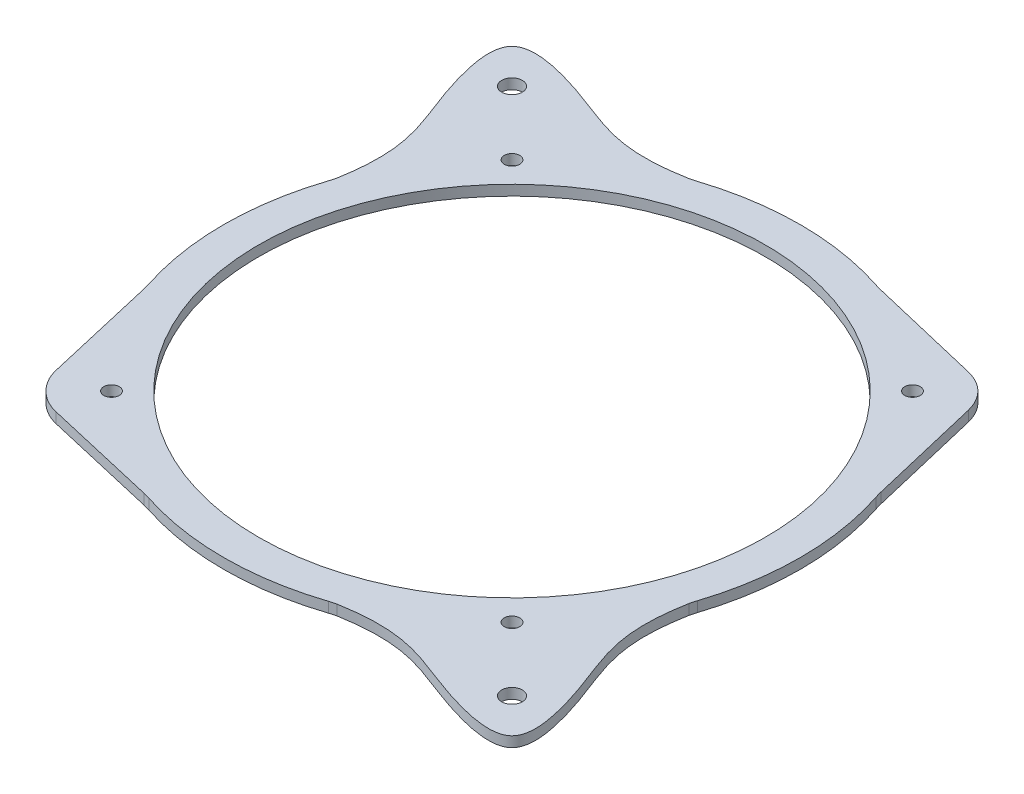
ISO-10303-21;
HEADER;
FILE_DESCRIPTION(('STEP AP214'),'2;1');
FILE_NAME('part.step','',(''),(''),'','','');
FILE_SCHEMA(('AUTOMOTIVE_DESIGN { 1 0 10303 214 1 1 1 1 }'));
ENDSEC;
DATA;
#1=APPLICATION_CONTEXT('core data for automotive mechanical design processes');
#2=APPLICATION_PROTOCOL_DEFINITION('international standard','automotive_design',2000,#1);
#3=PRODUCT_CONTEXT('',#1,'mechanical');
#4=PRODUCT('Part','Part','',(#3));
#5=PRODUCT_RELATED_PRODUCT_CATEGORY('part','',(#4));
#6=PRODUCT_DEFINITION_FORMATION('','',#4);
#7=PRODUCT_DEFINITION_CONTEXT('part definition',#1,'design');
#8=PRODUCT_DEFINITION('design','',#6,#7);
#9=PRODUCT_DEFINITION_SHAPE('','',#8);
#10=(LENGTH_UNIT() NAMED_UNIT(*) SI_UNIT(.MILLI.,.METRE.));
#11=(NAMED_UNIT(*) PLANE_ANGLE_UNIT() SI_UNIT($,.RADIAN.));
#12=(NAMED_UNIT(*) SI_UNIT($,.STERADIAN.) SOLID_ANGLE_UNIT());
#13=UNCERTAINTY_MEASURE_WITH_UNIT(LENGTH_MEASURE(1.E-05),#10,'distance_accuracy_value','');
#14=(GEOMETRIC_REPRESENTATION_CONTEXT(3) GLOBAL_UNCERTAINTY_ASSIGNED_CONTEXT((#13)) GLOBAL_UNIT_ASSIGNED_CONTEXT((#10,
#11,#12)) REPRESENTATION_CONTEXT('',''));
#15=CARTESIAN_POINT('',(0.,0.,0.));
#16=DIRECTION('',(0.,0.,1.));
#17=DIRECTION('',(1.,0.,0.));
#18=AXIS2_PLACEMENT_3D('',#15,#16,#17);
#19=CARTESIAN_POINT('',(-57.9062102339077,2.,-58.0554899764126));
#20=DIRECTION('',(0.,1.,0.));
#21=DIRECTION('',(0.,0.,1.));
#22=AXIS2_PLACEMENT_3D('',#19,#20,#21);
#23=PLANE('',#22);
#24=CARTESIAN_POINT('',(-51.265241636024,2.,-51.2652416360242));
#25=DIRECTION('',(0.,1.,0.));
#26=DIRECTION('',(0.,0.,1.));
#27=AXIS2_PLACEMENT_3D('',#24,#25,#26);
#28=CIRCLE('',#27,2.);
#29=CARTESIAN_POINT('',(-51.265241636024,2.,-49.2652416360242));
#30=VERTEX_POINT('',#29);
#31=EDGE_CURVE('E649',#30,#30,#28,.T.);
#32=ORIENTED_EDGE('',*,*,#31,.F.);
#33=EDGE_LOOP('',(#32));
#34=FACE_BOUND('',#33,.T.);
#35=CARTESIAN_POINT('',(51.2652416360254,2.,51.2652416360251));
#36=DIRECTION('',(0.,1.,0.));
#37=DIRECTION('',(0.,0.,-1.));
#38=AXIS2_PLACEMENT_3D('',#35,#36,#37);
#39=CIRCLE('',#38,2.00000000000001);
#40=CARTESIAN_POINT('',(51.2652416360254,2.,49.2652416360251));
#41=VERTEX_POINT('',#40);
#42=EDGE_CURVE('E641',#41,#41,#39,.T.);
#43=ORIENTED_EDGE('',*,*,#42,.F.);
#44=EDGE_LOOP('',(#43));
#45=FACE_BOUND('',#44,.T.);
#46=CARTESIAN_POINT('',(38.8907000000007,2.,38.8907000000005));
#47=DIRECTION('',(0.,1.,0.));
#48=DIRECTION('',(0.,0.,1.));
#49=AXIS2_PLACEMENT_3D('',#46,#47,#48);
#50=CIRCLE('',#49,1.5);
#51=CARTESIAN_POINT('',(38.8907000000007,2.,40.3907000000005));
#52=VERTEX_POINT('',#51);
#53=EDGE_CURVE('E621',#52,#52,#50,.T.);
#54=ORIENTED_EDGE('',*,*,#53,.F.);
#55=EDGE_LOOP('',(#54));
#56=FACE_BOUND('',#55,.T.);
#57=CARTESIAN_POINT('',(-38.8906999999993,2.,-38.8906999999996));
#58=DIRECTION('',(0.,1.,0.));
#59=DIRECTION('',(0.,0.,1.));
#60=AXIS2_PLACEMENT_3D('',#57,#58,#59);
#61=CIRCLE('',#60,1.5);
#62=CARTESIAN_POINT('',(-38.8906999999993,2.,-37.3906999999996));
#63=VERTEX_POINT('',#62);
#64=EDGE_CURVE('E605',#63,#63,#61,.T.);
#65=ORIENTED_EDGE('',*,*,#64,.F.);
#66=EDGE_LOOP('',(#65));
#67=FACE_BOUND('',#66,.T.);
#68=CARTESIAN_POINT('',(-18.5361486391086,2.,-52.9221194930724));
#69=CARTESIAN_POINT('',(-33.0898322809832,2.,-50.2752101267289));
#70=CARTESIAN_POINT('',(-38.2523816644955,2.,-56.5087525567802));
#71=CARTESIAN_POINT('',(-60.5913437385731,2.,-60.5915146691653));
#72=CARTESIAN_POINT('',(-56.5307882243021,2.,-38.3725544400051));
#73=CARTESIAN_POINT('',(-50.3627584827895,2.,-33.1719340145109));
#74=CARTESIAN_POINT('',(-52.8217319837832,2.,-18.8203126500064));
#75=B_SPLINE_CURVE_WITH_KNOTS('',3,(#68,#69,#70,#71,#72,#73,#74),.UNSPECIFIED.,.F.,.F.,(4,1,1,1,
4),(0.,0.378239645572201,0.501703935338034,0.625168225103867,1.),.UNSPECIFIED.);
#76=CARTESIAN_POINT('',(-18.5361486391086,2.,-52.9221194930724));
#77=VERTEX_POINT('',#76);
#78=CARTESIAN_POINT('',(-52.8217319837832,2.,-18.8203126500064));
#79=VERTEX_POINT('',#78);
#80=EDGE_CURVE('E311',#77,#79,#75,.T.);
#81=ORIENTED_EDGE('',*,*,#80,.T.);
#82=CARTESIAN_POINT('',(-68.3897200150771,2.,-22.5132449073711));
#83=DIRECTION('',(0.,-1.,0.));
#84=DIRECTION('',(0.,0.,1.));
#85=AXIS2_PLACEMENT_3D('',#82,#83,#84);
#86=CIRCLE('',#85,15.9999999999999);
#87=CARTESIAN_POINT('',(-53.1920044561713,2.,-17.5103015946212));
#88=VERTEX_POINT('',#87);
#89=EDGE_CURVE('E144',#79,#88,#86,.T.);
#90=ORIENTED_EDGE('',*,*,#89,.T.);
#91=CARTESIAN_POINT('',(3.88578058618805E-13,2.,3.85108611666851E-13));
#92=DIRECTION('',(0.,1.,0.));
#93=DIRECTION('',(0.,0.,1.));
#94=AXIS2_PLACEMENT_3D('',#91,#92,#93);
#95=CIRCLE('',#94,55.9999999999999);
#96=CARTESIAN_POINT('',(-53.2853459187858,2.,17.2241664621337));
#97=VERTEX_POINT('',#96);
#98=EDGE_CURVE('E391',#88,#97,#95,.T.);
#99=ORIENTED_EDGE('',*,*,#98,.T.);
#100=CARTESIAN_POINT('',(-68.5097304670106,2.,22.145356879886));
#101=DIRECTION('',(0.,-1.,0.));
#102=DIRECTION('',(0.,0.,1.));
#103=AXIS2_PLACEMENT_3D('',#100,#101,#102);
#104=CIRCLE('',#103,16.0000000000001);
#105=CARTESIAN_POINT('',(-52.9221194930763,2.,18.5361486391101));
#106=VERTEX_POINT('',#105);
#107=EDGE_CURVE('E411',#97,#106,#104,.T.);
#108=ORIENTED_EDGE('',*,*,#107,.T.);
#109=DIRECTION('',(0.225575515048493,0.,0.974225685870891));
#110=VECTOR('',#109,1.);
#111=CARTESIAN_POINT('',(-47.7632742489976,2.,40.8164016405666));
#112=LINE('',#111,#110);
#113=CARTESIAN_POINT('',(-47.7632742489976,2.,40.8164016405666));
#114=VERTEX_POINT('',#113);
#115=EDGE_CURVE('E407',#106,#114,#112,.T.);
#116=ORIENTED_EDGE('',*,*,#115,.T.);
#117=CARTESIAN_POINT('',(-38.9952430761602,2.,38.7862220051302));
#118=DIRECTION('',(0.,1.,0.));
#119=DIRECTION('',(0.,0.,1.));
#120=AXIS2_PLACEMENT_3D('',#117,#118,#119);
#121=CIRCLE('',#120,8.99999999999942);
#122=CARTESIAN_POINT('',(-45.253835364579,2.,45.2538353645801));
#123=VERTEX_POINT('',#122);
#124=EDGE_CURVE('E410',#114,#123,#121,.T.);
#125=ORIENTED_EDGE('',*,*,#124,.T.);
#126=CARTESIAN_POINT('',(-38.7862220051291,2.,38.9952430761613));
#127=DIRECTION('',(0.,1.,0.));
#128=DIRECTION('',(0.,0.,-1.));
#129=AXIS2_PLACEMENT_3D('',#126,#127,#128);
#130=CIRCLE('',#129,8.99999999999942);
#131=CARTESIAN_POINT('',(-40.8164016405654,2.,47.7632742489988));
#132=VERTEX_POINT('',#131);
#133=EDGE_CURVE('E415',#123,#132,#130,.T.);
#134=ORIENTED_EDGE('',*,*,#133,.T.);
#135=DIRECTION('',(0.974225685870891,0.,0.225575515048493));
#136=VECTOR('',#135,1.);
#137=CARTESIAN_POINT('',(-40.8164016405654,2.,47.7632742489988));
#138=LINE('',#137,#136);
#139=CARTESIAN_POINT('',(-18.536148639109,2.,52.9221194930774));
#140=VERTEX_POINT('',#139);
#141=EDGE_CURVE('E422',#132,#140,#138,.T.);
#142=ORIENTED_EDGE('',*,*,#141,.T.);
#143=CARTESIAN_POINT('',(-22.1453568798849,2.,68.5097304670117));
#144=DIRECTION('',(0.,-1.,0.));
#145=DIRECTION('',(0.,0.,-1.));
#146=AXIS2_PLACEMENT_3D('',#143,#144,#145);
#147=CIRCLE('',#146,16.0000000000001);
#148=CARTESIAN_POINT('',(-17.2241664621326,2.,53.2853459187871));
#149=VERTEX_POINT('',#148);
#150=EDGE_CURVE('E425',#140,#149,#147,.T.);
#151=ORIENTED_EDGE('',*,*,#150,.T.);
#152=CARTESIAN_POINT('',(3.88578058618805E-13,2.,3.85108611666851E-13));
#153=DIRECTION('',(0.,1.,0.));
#154=DIRECTION('',(0.,0.,-1.));
#155=AXIS2_PLACEMENT_3D('',#152,#153,#154);
#156=CIRCLE('',#155,56.0000000000003);
#157=CARTESIAN_POINT('',(17.5103015946224,2.,53.1920044561725));
#158=VERTEX_POINT('',#157);
#159=EDGE_CURVE('E428',#149,#158,#156,.T.);
#160=ORIENTED_EDGE('',*,*,#159,.T.);
#161=CARTESIAN_POINT('',(22.5132449073722,2.,68.3897200150783));
#162=DIRECTION('',(0.,-1.,0.));
#163=DIRECTION('',(0.,0.,-1.));
#164=AXIS2_PLACEMENT_3D('',#161,#162,#163);
#165=CIRCLE('',#164,15.9999999999999);
#166=CARTESIAN_POINT('',(18.8203126500077,2.,52.8217319837837));
#167=VERTEX_POINT('',#166);
#168=EDGE_CURVE('E431',#158,#167,#165,.T.);
#169=ORIENTED_EDGE('',*,*,#168,.T.);
#170=CARTESIAN_POINT('',(18.8203126500077,2.,52.8217319837837));
#171=CARTESIAN_POINT('',(33.1719340145121,2.,50.36275848279));
#172=CARTESIAN_POINT('',(38.3725544400063,2.,56.5307882243025));
#173=CARTESIAN_POINT('',(60.5915146691666,2.,60.5913437385733));
#174=CARTESIAN_POINT('',(56.5087525567814,2.,38.2523816644958));
#175=CARTESIAN_POINT('',(50.2752101267299,2.,33.0898322809835));
#176=CARTESIAN_POINT('',(52.9221194930734,2.,18.5361486391089));
#177=B_SPLINE_CURVE_WITH_KNOTS('',3,(#170,#171,#172,#173,#174,#175,#176),.UNSPECIFIED.,.F.,.F.,
(4,1,1,1,4),(0.,0.374831774896133,0.498296064661966,0.621760354427798,1.),.UNSPECIFIED.);
#178=CARTESIAN_POINT('',(52.9221194930736,2.,18.5361486391097));
#179=VERTEX_POINT('',#178);
#180=EDGE_CURVE('E434',#167,#179,#177,.T.);
#181=ORIENTED_EDGE('',*,*,#180,.T.);
#182=CARTESIAN_POINT('',(68.5097304670078,2.,22.1453568798855));
#183=DIRECTION('',(0.,-1.,0.));
#184=DIRECTION('',(0.,0.,-1.));
#185=AXIS2_PLACEMENT_3D('',#182,#183,#184);
#186=CIRCLE('',#185,15.9999999999999);
#187=CARTESIAN_POINT('',(53.2853459187831,2.,17.2241664621332));
#188=VERTEX_POINT('',#187);
#189=EDGE_CURVE('E440',#179,#188,#186,.T.);
#190=ORIENTED_EDGE('',*,*,#189,.T.);
#191=CARTESIAN_POINT('',(3.88578058618805E-13,2.,3.85108611666851E-13));
#192=DIRECTION('',(0.,1.,0.));
#193=DIRECTION('',(0.,0.,-1.));
#194=AXIS2_PLACEMENT_3D('',#191,#192,#193);
#195=CIRCLE('',#194,55.9999999999964);
#196=CARTESIAN_POINT('',(53.1920044561682,2.,-17.5103015946187));
#197=VERTEX_POINT('',#196);
#198=EDGE_CURVE('E563',#188,#197,#195,.T.);
#199=ORIENTED_EDGE('',*,*,#198,.T.);
#200=CARTESIAN_POINT('',(68.3897200150744,2.,-22.5132449073677));
#201=DIRECTION('',(0.,-1.,0.));
#202=DIRECTION('',(0.,0.,-1.));
#203=AXIS2_PLACEMENT_3D('',#200,#201,#202);
#204=CIRCLE('',#203,15.9999999999999);
#205=CARTESIAN_POINT('',(52.8217319837804,2.,-18.820312650003));
#206=VERTEX_POINT('',#205);
#207=EDGE_CURVE('E542',#197,#206,#204,.T.);
#208=ORIENTED_EDGE('',*,*,#207,.T.);
#209=DIRECTION('',(-0.230808266085289,0.,-0.97299925195588));
#210=VECTOR('',#209,1.);
#211=CARTESIAN_POINT('',(52.8217319837804,2.,-18.820312650003));
#212=LINE('',#211,#210);
#213=CARTESIAN_POINT('',(47.5432152727266,2.,-41.0725174709259));
#214=VERTEX_POINT('',#213);
#215=EDGE_CURVE('E554',#206,#214,#212,.T.);
#216=ORIENTED_EDGE('',*,*,#215,.T.);
#217=CARTESIAN_POINT('',(38.7862220051243,2.,-38.9952430761583));
#218=DIRECTION('',(0.,1.,0.));
#219=DIRECTION('',(0.,0.,-1.));
#220=AXIS2_PLACEMENT_3D('',#217,#218,#219);
#221=CIRCLE('',#220,8.99999999999942);
#222=CARTESIAN_POINT('',(45.2538353645762,2.,-45.2538353645751));
#223=VERTEX_POINT('',#222);
#224=EDGE_CURVE('E550',#214,#223,#221,.T.);
#225=ORIENTED_EDGE('',*,*,#224,.T.);
#226=CARTESIAN_POINT('',(38.9952430761595,2.,-38.7862220051232));
#227=DIRECTION('',(0.,1.,0.));
#228=DIRECTION('',(0.,0.,1.));
#229=AXIS2_PLACEMENT_3D('',#226,#227,#228);
#230=CIRCLE('',#229,8.9999999999994);
#231=CARTESIAN_POINT('',(41.072517470927,2.,-47.5432152727255));
#232=VERTEX_POINT('',#231);
#233=EDGE_CURVE('E553',#223,#232,#230,.T.);
#234=ORIENTED_EDGE('',*,*,#233,.T.);
#235=DIRECTION('',(-0.97299925195588,0.,-0.230808266085289));
#236=VECTOR('',#235,1.);
#237=CARTESIAN_POINT('',(18.8203126500042,2.,-52.8217319837792));
#238=LINE('',#237,#236);
#239=CARTESIAN_POINT('',(18.8203126500042,2.,-52.8217319837792));
#240=VERTEX_POINT('',#239);
#241=EDGE_CURVE('E205',#232,#240,#238,.T.);
#242=ORIENTED_EDGE('',*,*,#241,.T.);
#243=CARTESIAN_POINT('',(22.5132449073689,2.,-68.3897200150733));
#244=DIRECTION('',(0.,-1.,0.));
#245=DIRECTION('',(0.,0.,1.));
#246=AXIS2_PLACEMENT_3D('',#243,#244,#245);
#247=CIRCLE('',#246,16.);
#248=CARTESIAN_POINT('',(17.5103015946199,2.,-53.1920044561671));
#249=VERTEX_POINT('',#248);
#250=EDGE_CURVE('E199',#240,#249,#247,.T.);
#251=ORIENTED_EDGE('',*,*,#250,.T.);
#252=CARTESIAN_POINT('',(-2.29687533889309E-12,2.,4.40669160380655E-12));
#253=DIRECTION('',(0.,1.,0.));
#254=DIRECTION('',(0.,0.,1.));
#255=AXIS2_PLACEMENT_3D('',#252,#253,#254);
#256=CIRCLE('',#255,56.);
#257=CARTESIAN_POINT('',(-17.2241664621319,2.,-53.2853459187821));
#258=VERTEX_POINT('',#257);
#259=EDGE_CURVE('E203',#249,#258,#256,.T.);
#260=ORIENTED_EDGE('',*,*,#259,.T.);
#261=CARTESIAN_POINT('',(-17.2241664621319,2.,-53.2853459187821));
#262=CARTESIAN_POINT('',(-18.5361486391086,2.,-52.9221194930724));
#263=B_SPLINE_CURVE_WITH_KNOTS('',1,(#261,#262),.UNSPECIFIED.,.F.,.F.,(2,2),(0.,1.),.UNSPECIFIED.);
#264=EDGE_CURVE('E60',#258,#77,#263,.T.);
#265=ORIENTED_EDGE('',*,*,#264,.T.);
#266=EDGE_LOOP('',(#81,#90,#99,#108,#116,#125,#134,#142,#151,#160,#169,#181,#190,#199,#208,#216,
#225,#234,#242,#251,#260,#265));
#267=FACE_BOUND('',#266,.T.);
#268=CARTESIAN_POINT('',(3.88578058618805E-13,2.,3.85108611666851E-13));
#269=DIRECTION('',(0.,1.,0.));
#270=DIRECTION('',(0.,0.,1.));
#271=AXIS2_PLACEMENT_3D('',#268,#269,#270);
#272=CIRCLE('',#271,49.2);
#273=CARTESIAN_POINT('',(3.88578058618805E-13,2.,49.2000000000004));
#274=VERTEX_POINT('',#273);
#275=EDGE_CURVE('E240',#274,#274,#272,.T.);
#276=ORIENTED_EDGE('',*,*,#275,.F.);
#277=EDGE_LOOP('',(#276));
#278=FACE_BOUND('',#277,.T.);
#279=CARTESIAN_POINT('',(38.8907000000007,2.,-38.8906999999996));
#280=DIRECTION('',(0.,1.,0.));
#281=DIRECTION('',(0.,0.,-1.));
#282=AXIS2_PLACEMENT_3D('',#279,#280,#281);
#283=CIRCLE('',#282,1.5);
#284=CARTESIAN_POINT('',(38.8907000000007,2.,-40.3906999999996));
#285=VERTEX_POINT('',#284);
#286=EDGE_CURVE('E613',#285,#285,#283,.T.);
#287=ORIENTED_EDGE('',*,*,#286,.F.);
#288=EDGE_LOOP('',(#287));
#289=FACE_BOUND('',#288,.T.);
#290=CARTESIAN_POINT('',(-38.8906999999993,2.,38.8907000000005));
#291=DIRECTION('',(0.,1.,0.));
#292=DIRECTION('',(0.,0.,-1.));
#293=AXIS2_PLACEMENT_3D('',#290,#291,#292);
#294=CIRCLE('',#293,1.5);
#295=CARTESIAN_POINT('',(-38.8906999999993,2.,37.3907000000005));
#296=VERTEX_POINT('',#295);
#297=EDGE_CURVE('E629',#296,#296,#294,.T.);
#298=ORIENTED_EDGE('',*,*,#297,.F.);
#299=EDGE_LOOP('',(#298));
#300=FACE_BOUND('',#299,.T.);
#301=ADVANCED_FACE('F41',(#34,#45,#56,#67,#267,#278,#289,#300),#23,.T.);
#302=CARTESIAN_POINT('',(-57.9062102339077,0.,-58.0554899764126));
#303=DIRECTION('',(0.,1.,0.));
#304=DIRECTION('',(0.,0.,1.));
#305=AXIS2_PLACEMENT_3D('',#302,#303,#304);
#306=PLANE('',#305);
#307=CARTESIAN_POINT('',(-51.265241636024,0.,-51.2652416360242));
#308=DIRECTION('',(0.,1.,0.));
#309=DIRECTION('',(0.,0.,1.));
#310=AXIS2_PLACEMENT_3D('',#307,#308,#309);
#311=CIRCLE('',#310,2.);
#312=CARTESIAN_POINT('',(-51.265241636024,0.,-49.2652416360242));
#313=VERTEX_POINT('',#312);
#314=EDGE_CURVE('E637',#313,#313,#311,.T.);
#315=ORIENTED_EDGE('',*,*,#314,.T.);
#316=EDGE_LOOP('',(#315));
#317=FACE_BOUND('',#316,.T.);
#318=CARTESIAN_POINT('',(51.2652416360254,0.,51.2652416360251));
#319=DIRECTION('',(0.,1.,0.));
#320=DIRECTION('',(0.,0.,-1.));
#321=AXIS2_PLACEMENT_3D('',#318,#319,#320);
#322=CIRCLE('',#321,2.00000000000001);
#323=CARTESIAN_POINT('',(51.2652416360254,0.,49.2652416360251));
#324=VERTEX_POINT('',#323);
#325=EDGE_CURVE('E645',#324,#324,#322,.T.);
#326=ORIENTED_EDGE('',*,*,#325,.T.);
#327=EDGE_LOOP('',(#326));
#328=FACE_BOUND('',#327,.T.);
#329=CARTESIAN_POINT('',(-18.5361486391086,0.,-52.9221194930724));
#330=CARTESIAN_POINT('',(-33.0898322809832,0.,-50.2752101267289));
#331=CARTESIAN_POINT('',(-38.2523816644955,0.,-56.5087525567802));
#332=CARTESIAN_POINT('',(-60.5913437385731,0.,-60.5915146691653));
#333=CARTESIAN_POINT('',(-56.5307882243021,0.,-38.3725544400051));
#334=CARTESIAN_POINT('',(-50.3627584827895,0.,-33.1719340145109));
#335=CARTESIAN_POINT('',(-52.8217319837832,0.,-18.8203126500064));
#336=B_SPLINE_CURVE_WITH_KNOTS('',3,(#329,#330,#331,#332,#333,#334,#335),.UNSPECIFIED.,.F.,.F.,
(4,1,1,1,4),(0.,0.378239645572201,0.501703935338034,0.625168225103867,1.),.UNSPECIFIED.);
#337=CARTESIAN_POINT('',(-18.5361486391086,0.,-52.9221194930724));
#338=VERTEX_POINT('',#337);
#339=CARTESIAN_POINT('',(-52.8217319837832,0.,-18.8203126500064));
#340=VERTEX_POINT('',#339);
#341=EDGE_CURVE('E230',#338,#340,#336,.T.);
#342=ORIENTED_EDGE('',*,*,#341,.F.);
#343=CARTESIAN_POINT('',(-17.2241664621319,0.,-53.2853459187821));
#344=CARTESIAN_POINT('',(-18.5361486391086,0.,-52.9221194930724));
#345=B_SPLINE_CURVE_WITH_KNOTS('',1,(#343,#344),.UNSPECIFIED.,.F.,.F.,(2,2),(0.,1.),.UNSPECIFIED.);
#346=CARTESIAN_POINT('',(-17.2241664621319,0.,-53.2853459187821));
#347=VERTEX_POINT('',#346);
#348=EDGE_CURVE('E136',#347,#338,#345,.T.);
#349=ORIENTED_EDGE('',*,*,#348,.F.);
#350=CARTESIAN_POINT('',(3.88578058618805E-13,0.,3.85108611666851E-13));
#351=DIRECTION('',(0.,1.,0.));
#352=DIRECTION('',(0.,0.,1.));
#353=AXIS2_PLACEMENT_3D('',#350,#351,#352);
#354=CIRCLE('',#353,55.999999999996);
#355=CARTESIAN_POINT('',(17.5103015946199,0.,-53.1920044561671));
#356=VERTEX_POINT('',#355);
#357=EDGE_CURVE('E130',#356,#347,#354,.T.);
#358=ORIENTED_EDGE('',*,*,#357,.F.);
#359=CARTESIAN_POINT('',(22.5132449073689,0.,-68.3897200150733));
#360=DIRECTION('',(0.,-1.,0.));
#361=DIRECTION('',(0.,0.,1.));
#362=AXIS2_PLACEMENT_3D('',#359,#360,#361);
#363=CIRCLE('',#362,16.);
#364=CARTESIAN_POINT('',(18.8203126500042,0.,-52.8217319837792));
#365=VERTEX_POINT('',#364);
#366=EDGE_CURVE('E215',#365,#356,#363,.T.);
#367=ORIENTED_EDGE('',*,*,#366,.F.);
#368=DIRECTION('',(-0.97299925195588,0.,-0.230808266085289));
#369=VECTOR('',#368,1.);
#370=CARTESIAN_POINT('',(18.8203126500042,0.,-52.8217319837792));
#371=LINE('',#370,#369);
#372=CARTESIAN_POINT('',(41.072517470927,0.,-47.5432152727255));
#373=VERTEX_POINT('',#372);
#374=EDGE_CURVE('E300',#373,#365,#371,.T.);
#375=ORIENTED_EDGE('',*,*,#374,.F.);
#376=CARTESIAN_POINT('',(38.9952430761595,0.,-38.7862220051232));
#377=DIRECTION('',(0.,1.,0.));
#378=DIRECTION('',(0.,0.,1.));
#379=AXIS2_PLACEMENT_3D('',#376,#377,#378);
#380=CIRCLE('',#379,8.9999999999994);
#381=CARTESIAN_POINT('',(45.2538353645762,0.,-45.2538353645751));
#382=VERTEX_POINT('',#381);
#383=EDGE_CURVE('E297',#382,#373,#380,.T.);
#384=ORIENTED_EDGE('',*,*,#383,.F.);
#385=CARTESIAN_POINT('',(38.7862220051243,0.,-38.9952430761583));
#386=DIRECTION('',(0.,1.,0.));
#387=DIRECTION('',(0.,0.,-1.));
#388=AXIS2_PLACEMENT_3D('',#385,#386,#387);
#389=CIRCLE('',#388,8.99999999999942);
#390=CARTESIAN_POINT('',(47.5432152727266,0.,-41.0725174709259));
#391=VERTEX_POINT('',#390);
#392=EDGE_CURVE('E294',#391,#382,#389,.T.);
#393=ORIENTED_EDGE('',*,*,#392,.F.);
#394=DIRECTION('',(-0.230808266085289,0.,-0.97299925195588));
#395=VECTOR('',#394,1.);
#396=CARTESIAN_POINT('',(52.8217319837804,0.,-18.820312650003));
#397=LINE('',#396,#395);
#398=CARTESIAN_POINT('',(52.8217319837804,0.,-18.820312650003));
#399=VERTEX_POINT('',#398);
#400=EDGE_CURVE('E291',#399,#391,#397,.T.);
#401=ORIENTED_EDGE('',*,*,#400,.F.);
#402=CARTESIAN_POINT('',(68.3897200150744,0.,-22.5132449073677));
#403=DIRECTION('',(0.,-1.,0.));
#404=DIRECTION('',(0.,0.,-1.));
#405=AXIS2_PLACEMENT_3D('',#402,#403,#404);
#406=CIRCLE('',#405,15.9999999999999);
#407=CARTESIAN_POINT('',(53.1920044561682,0.,-17.5103015946187));
#408=VERTEX_POINT('',#407);
#409=EDGE_CURVE('E288',#408,#399,#406,.T.);
#410=ORIENTED_EDGE('',*,*,#409,.F.);
#411=CARTESIAN_POINT('',(-2.29687533889309E-12,0.,4.40669160380655E-12));
#412=DIRECTION('',(0.,1.,0.));
#413=DIRECTION('',(0.,0.,-1.));
#414=AXIS2_PLACEMENT_3D('',#411,#412,#413);
#415=CIRCLE('',#414,55.9999999999992);
#416=CARTESIAN_POINT('',(53.2853459187831,0.,17.2241664621332));
#417=VERTEX_POINT('',#416);
#418=EDGE_CURVE('E285',#417,#408,#415,.T.);
#419=ORIENTED_EDGE('',*,*,#418,.F.);
#420=CARTESIAN_POINT('',(68.5097304670078,0.,22.1453568798855));
#421=DIRECTION('',(0.,-1.,0.));
#422=DIRECTION('',(0.,0.,-1.));
#423=AXIS2_PLACEMENT_3D('',#420,#421,#422);
#424=CIRCLE('',#423,15.9999999999999);
#425=CARTESIAN_POINT('',(52.9221194930736,0.,18.5361486391097));
#426=VERTEX_POINT('',#425);
#427=EDGE_CURVE('E278',#426,#417,#424,.T.);
#428=ORIENTED_EDGE('',*,*,#427,.F.);
#429=CARTESIAN_POINT('',(18.8203126500077,0.,52.8217319837837));
#430=CARTESIAN_POINT('',(33.1719340145121,0.,50.36275848279));
#431=CARTESIAN_POINT('',(38.3725544400063,0.,56.5307882243025));
#432=CARTESIAN_POINT('',(60.5915146691666,0.,60.5913437385733));
#433=CARTESIAN_POINT('',(56.5087525567814,0.,38.2523816644958));
#434=CARTESIAN_POINT('',(50.2752101267299,0.,33.0898322809835));
#435=CARTESIAN_POINT('',(52.9221194930734,0.,18.5361486391089));
#436=B_SPLINE_CURVE_WITH_KNOTS('',3,(#429,#430,#431,#432,#433,#434,#435),.UNSPECIFIED.,.F.,.F.,
(4,1,1,1,4),(0.,0.374831774896133,0.498296064661966,0.621760354427798,1.),.UNSPECIFIED.);
#437=CARTESIAN_POINT('',(18.8203126500077,0.,52.8217319837837));
#438=VERTEX_POINT('',#437);
#439=EDGE_CURVE('E273',#438,#426,#436,.T.);
#440=ORIENTED_EDGE('',*,*,#439,.F.);
#441=CARTESIAN_POINT('',(22.5132449073722,0.,68.3897200150783));
#442=DIRECTION('',(0.,-1.,0.));
#443=DIRECTION('',(0.,0.,-1.));
#444=AXIS2_PLACEMENT_3D('',#441,#442,#443);
#445=CIRCLE('',#444,15.9999999999999);
#446=CARTESIAN_POINT('',(17.5103015946224,0.,53.1920044561725));
#447=VERTEX_POINT('',#446);
#448=EDGE_CURVE('E270',#447,#438,#445,.T.);
#449=ORIENTED_EDGE('',*,*,#448,.F.);
#450=CARTESIAN_POINT('',(3.88578058618805E-13,0.,3.85108611666851E-13));
#451=DIRECTION('',(0.,1.,0.));
#452=DIRECTION('',(0.,0.,-1.));
#453=AXIS2_PLACEMENT_3D('',#450,#451,#452);
#454=CIRCLE('',#453,56.0000000000003);
#455=CARTESIAN_POINT('',(-17.2241664621326,0.,53.2853459187871));
#456=VERTEX_POINT('',#455);
#457=EDGE_CURVE('E267',#456,#447,#454,.T.);
#458=ORIENTED_EDGE('',*,*,#457,.F.);
#459=CARTESIAN_POINT('',(-22.1453568798849,0.,68.5097304670117));
#460=DIRECTION('',(0.,-1.,0.));
#461=DIRECTION('',(0.,0.,-1.));
#462=AXIS2_PLACEMENT_3D('',#459,#460,#461);
#463=CIRCLE('',#462,16.0000000000001);
#464=CARTESIAN_POINT('',(-18.536148639109,0.,52.9221194930774));
#465=VERTEX_POINT('',#464);
#466=EDGE_CURVE('E264',#465,#456,#463,.T.);
#467=ORIENTED_EDGE('',*,*,#466,.F.);
#468=DIRECTION('',(0.974225685870891,0.,0.225575515048493));
#469=VECTOR('',#468,1.);
#470=CARTESIAN_POINT('',(-40.8164016405654,0.,47.7632742489988));
#471=LINE('',#470,#469);
#472=CARTESIAN_POINT('',(-40.8164016405654,0.,47.7632742489988));
#473=VERTEX_POINT('',#472);
#474=EDGE_CURVE('E261',#473,#465,#471,.T.);
#475=ORIENTED_EDGE('',*,*,#474,.F.);
#476=CARTESIAN_POINT('',(-38.7862220051291,0.,38.9952430761613));
#477=DIRECTION('',(0.,1.,0.));
#478=DIRECTION('',(0.,0.,-1.));
#479=AXIS2_PLACEMENT_3D('',#476,#477,#478);
#480=CIRCLE('',#479,8.99999999999942);
#481=CARTESIAN_POINT('',(-45.253835364579,0.,45.2538353645801));
#482=VERTEX_POINT('',#481);
#483=EDGE_CURVE('E258',#482,#473,#480,.T.);
#484=ORIENTED_EDGE('',*,*,#483,.F.);
#485=CARTESIAN_POINT('',(-38.9952430761602,0.,38.7862220051302));
#486=DIRECTION('',(0.,1.,0.));
#487=DIRECTION('',(0.,0.,1.));
#488=AXIS2_PLACEMENT_3D('',#485,#486,#487);
#489=CIRCLE('',#488,8.99999999999942);
#490=CARTESIAN_POINT('',(-47.7632742489976,0.,40.8164016405666));
#491=VERTEX_POINT('',#490);
#492=EDGE_CURVE('E255',#491,#482,#489,.T.);
#493=ORIENTED_EDGE('',*,*,#492,.F.);
#494=DIRECTION('',(0.225575515048493,0.,0.974225685870891));
#495=VECTOR('',#494,1.);
#496=CARTESIAN_POINT('',(-47.7632742489976,0.,40.8164016405666));
#497=LINE('',#496,#495);
#498=CARTESIAN_POINT('',(-52.9221194930763,0.,18.5361486391101));
#499=VERTEX_POINT('',#498);
#500=EDGE_CURVE('E252',#499,#491,#497,.T.);
#501=ORIENTED_EDGE('',*,*,#500,.F.);
#502=CARTESIAN_POINT('',(-68.5097304670106,0.,22.145356879886));
#503=DIRECTION('',(0.,-1.,0.));
#504=DIRECTION('',(0.,0.,1.));
#505=AXIS2_PLACEMENT_3D('',#502,#503,#504);
#506=CIRCLE('',#505,16.0000000000001);
#507=CARTESIAN_POINT('',(-53.2853459187858,0.,17.2241664621337));
#508=VERTEX_POINT('',#507);
#509=EDGE_CURVE('E249',#508,#499,#506,.T.);
#510=ORIENTED_EDGE('',*,*,#509,.F.);
#511=CARTESIAN_POINT('',(3.88578058618805E-13,0.,3.85108611666851E-13));
#512=DIRECTION('',(0.,1.,0.));
#513=DIRECTION('',(0.,0.,1.));
#514=AXIS2_PLACEMENT_3D('',#511,#512,#513);
#515=CIRCLE('',#514,55.9999999999999);
#516=CARTESIAN_POINT('',(-53.1920044561713,0.,-17.5103015946212));
#517=VERTEX_POINT('',#516);
#518=EDGE_CURVE('E246',#517,#508,#515,.T.);
#519=ORIENTED_EDGE('',*,*,#518,.F.);
#520=CARTESIAN_POINT('',(-68.3897200150771,0.,-22.5132449073711));
#521=DIRECTION('',(0.,-1.,0.));
#522=DIRECTION('',(0.,0.,1.));
#523=AXIS2_PLACEMENT_3D('',#520,#521,#522);
#524=CIRCLE('',#523,15.9999999999999);
#525=EDGE_CURVE('E239',#340,#517,#524,.T.);
#526=ORIENTED_EDGE('',*,*,#525,.F.);
#527=EDGE_LOOP('',(#342,#349,#358,#367,#375,#384,#393,#401,#410,#419,#428,#440,#449,#458,#467,
#475,#484,#493,#501,#510,#519,#526));
#528=FACE_BOUND('',#527,.T.);
#529=CARTESIAN_POINT('',(3.88578058618805E-13,0.,3.85108611666851E-13));
#530=DIRECTION('',(0.,1.,0.));
#531=DIRECTION('',(0.,0.,1.));
#532=AXIS2_PLACEMENT_3D('',#529,#530,#531);
#533=CIRCLE('',#532,49.2);
#534=CARTESIAN_POINT('',(3.88578058618805E-13,0.,49.2000000000004));
#535=VERTEX_POINT('',#534);
#536=EDGE_CURVE('E597',#535,#535,#533,.T.);
#537=ORIENTED_EDGE('',*,*,#536,.T.);
#538=EDGE_LOOP('',(#537));
#539=FACE_BOUND('',#538,.T.);
#540=CARTESIAN_POINT('',(-38.8906999999993,0.,-38.8906999999996));
#541=DIRECTION('',(0.,1.,0.));
#542=DIRECTION('',(0.,0.,1.));
#543=AXIS2_PLACEMENT_3D('',#540,#541,#542);
#544=CIRCLE('',#543,1.5);
#545=CARTESIAN_POINT('',(-38.8906999999993,0.,-37.3906999999996));
#546=VERTEX_POINT('',#545);
#547=EDGE_CURVE('E609',#546,#546,#544,.T.);
#548=ORIENTED_EDGE('',*,*,#547,.T.);
#549=EDGE_LOOP('',(#548));
#550=FACE_BOUND('',#549,.T.);
#551=CARTESIAN_POINT('',(38.8907000000007,0.,-38.8906999999996));
#552=DIRECTION('',(0.,1.,0.));
#553=DIRECTION('',(0.,0.,-1.));
#554=AXIS2_PLACEMENT_3D('',#551,#552,#553);
#555=CIRCLE('',#554,1.5);
#556=CARTESIAN_POINT('',(38.8907000000007,0.,-40.3906999999996));
#557=VERTEX_POINT('',#556);
#558=EDGE_CURVE('E617',#557,#557,#555,.T.);
#559=ORIENTED_EDGE('',*,*,#558,.T.);
#560=EDGE_LOOP('',(#559));
#561=FACE_BOUND('',#560,.T.);
#562=CARTESIAN_POINT('',(38.8907000000007,0.,38.8907000000005));
#563=DIRECTION('',(0.,1.,0.));
#564=DIRECTION('',(0.,0.,1.));
#565=AXIS2_PLACEMENT_3D('',#562,#563,#564);
#566=CIRCLE('',#565,1.5);
#567=CARTESIAN_POINT('',(38.8907000000007,0.,40.3907000000005));
#568=VERTEX_POINT('',#567);
#569=EDGE_CURVE('E625',#568,#568,#566,.T.);
#570=ORIENTED_EDGE('',*,*,#569,.T.);
#571=EDGE_LOOP('',(#570));
#572=FACE_BOUND('',#571,.T.);
#573=CARTESIAN_POINT('',(-38.8906999999993,0.,38.8907000000005));
#574=DIRECTION('',(0.,1.,0.));
#575=DIRECTION('',(0.,0.,-1.));
#576=AXIS2_PLACEMENT_3D('',#573,#574,#575);
#577=CIRCLE('',#576,1.5);
#578=CARTESIAN_POINT('',(-38.8906999999993,0.,37.3907000000005));
#579=VERTEX_POINT('',#578);
#580=EDGE_CURVE('E633',#579,#579,#577,.T.);
#581=ORIENTED_EDGE('',*,*,#580,.T.);
#582=EDGE_LOOP('',(#581));
#583=FACE_BOUND('',#582,.T.);
#584=ADVANCED_FACE('F395',(#317,#328,#528,#539,#550,#561,#572,#583),#306,.F.);
#585=DIRECTION('',(0.,-1.,0.));
#586=VECTOR('',#585,1.);
#587=SURFACE_OF_LINEAR_EXTRUSION('',#75,#586);
#588=ORIENTED_EDGE('',*,*,#341,.T.);
#589=DIRECTION('',(0.,-1.,0.));
#590=VECTOR('',#589,1.);
#591=CARTESIAN_POINT('',(-52.8217319837832,2.,-18.8203126500064));
#592=LINE('',#591,#590);
#593=EDGE_CURVE('E11',#79,#340,#592,.T.);
#594=ORIENTED_EDGE('',*,*,#593,.F.);
#595=ORIENTED_EDGE('',*,*,#80,.F.);
#596=DIRECTION('',(0.,-1.,0.));
#597=VECTOR('',#596,1.);
#598=CARTESIAN_POINT('',(-18.5361486391086,2.,-52.9221194930724));
#599=LINE('',#598,#597);
#600=EDGE_CURVE('E224',#77,#338,#599,.T.);
#601=ORIENTED_EDGE('',*,*,#600,.T.);
#602=EDGE_LOOP('',(#588,#594,#595,#601));
#603=FACE_BOUND('',#602,.T.);
#604=ADVANCED_FACE('F43',(#603),#587,.F.);
#605=CARTESIAN_POINT('',(-68.3897200150771,2.,-22.5132449073711));
#606=DIRECTION('',(0.,-1.,0.));
#607=DIRECTION('',(0.,0.,-1.));
#608=AXIS2_PLACEMENT_3D('',#605,#606,#607);
#609=CYLINDRICAL_SURFACE('',#608,15.9999999999999);
#610=ORIENTED_EDGE('',*,*,#525,.T.);
#611=DIRECTION('',(0.,-1.,0.));
#612=VECTOR('',#611,1.);
#613=CARTESIAN_POINT('',(-53.1920044561713,2.,-17.5103015946212));
#614=LINE('',#613,#612);
#615=EDGE_CURVE('E52',#88,#517,#614,.T.);
#616=ORIENTED_EDGE('',*,*,#615,.F.);
#617=ORIENTED_EDGE('',*,*,#89,.F.);
#618=ORIENTED_EDGE('',*,*,#593,.T.);
#619=EDGE_LOOP('',(#610,#616,#617,#618));
#620=FACE_BOUND('',#619,.T.);
#621=ADVANCED_FACE('F482',(#620),#609,.F.);
#622=CARTESIAN_POINT('',(3.88578058618805E-13,2.,3.85108611666851E-13));
#623=DIRECTION('',(0.,-1.,0.));
#624=DIRECTION('',(0.,0.,-1.));
#625=AXIS2_PLACEMENT_3D('',#622,#623,#624);
#626=CYLINDRICAL_SURFACE('',#625,55.9999999999999);
#627=ORIENTED_EDGE('',*,*,#518,.T.);
#628=DIRECTION('',(0.,-1.,0.));
#629=VECTOR('',#628,1.);
#630=CARTESIAN_POINT('',(-53.2853459187858,2.,17.2241664621337));
#631=LINE('',#630,#629);
#632=EDGE_CURVE('E381',#97,#508,#631,.T.);
#633=ORIENTED_EDGE('',*,*,#632,.F.);
#634=ORIENTED_EDGE('',*,*,#98,.F.);
#635=ORIENTED_EDGE('',*,*,#615,.T.);
#636=EDGE_LOOP('',(#627,#633,#634,#635));
#637=FACE_BOUND('',#636,.T.);
#638=ADVANCED_FACE('F389',(#637),#626,.T.);
#639=CARTESIAN_POINT('',(-68.5097304670106,2.,22.145356879886));
#640=DIRECTION('',(0.,-1.,0.));
#641=DIRECTION('',(0.,0.,-1.));
#642=AXIS2_PLACEMENT_3D('',#639,#640,#641);
#643=CYLINDRICAL_SURFACE('',#642,16.0000000000001);
#644=ORIENTED_EDGE('',*,*,#509,.T.);
#645=DIRECTION('',(0.,-1.,0.));
#646=VECTOR('',#645,1.);
#647=CARTESIAN_POINT('',(-52.9221194930763,2.,18.5361486391101));
#648=LINE('',#647,#646);
#649=EDGE_CURVE('E377',#106,#499,#648,.T.);
#650=ORIENTED_EDGE('',*,*,#649,.F.);
#651=ORIENTED_EDGE('',*,*,#107,.F.);
#652=ORIENTED_EDGE('',*,*,#632,.T.);
#653=EDGE_LOOP('',(#644,#650,#651,#652));
#654=FACE_BOUND('',#653,.T.);
#655=ADVANCED_FACE('F401',(#654),#643,.F.);
#656=CARTESIAN_POINT('',(-47.7632742489976,2.,40.8164016405666));
#657=DIRECTION('',(0.974225685870891,0.,-0.225575515048493));
#658=DIRECTION('',(-0.225575515048493,0.,-0.974225685870891));
#659=AXIS2_PLACEMENT_3D('',#656,#657,#658);
#660=PLANE('',#659);
#661=ORIENTED_EDGE('',*,*,#500,.T.);
#662=DIRECTION('',(0.,-1.,0.));
#663=VECTOR('',#662,1.);
#664=CARTESIAN_POINT('',(-47.7632742489976,2.,40.8164016405666));
#665=LINE('',#664,#663);
#666=EDGE_CURVE('E373',#114,#491,#665,.T.);
#667=ORIENTED_EDGE('',*,*,#666,.F.);
#668=ORIENTED_EDGE('',*,*,#115,.F.);
#669=ORIENTED_EDGE('',*,*,#649,.T.);
#670=EDGE_LOOP('',(#661,#667,#668,#669));
#671=FACE_BOUND('',#670,.T.);
#672=ADVANCED_FACE('F405',(#671),#660,.F.);
#673=CARTESIAN_POINT('',(-38.9952430761602,2.,38.7862220051302));
#674=DIRECTION('',(0.,-1.,0.));
#675=DIRECTION('',(0.,0.,-1.));
#676=AXIS2_PLACEMENT_3D('',#673,#674,#675);
#677=CYLINDRICAL_SURFACE('',#676,8.99999999999942);
#678=ORIENTED_EDGE('',*,*,#492,.T.);
#679=DIRECTION('',(0.,-1.,0.));
#680=VECTOR('',#679,1.);
#681=CARTESIAN_POINT('',(-45.253835364579,2.,45.2538353645801));
#682=LINE('',#681,#680);
#683=EDGE_CURVE('E369',#123,#482,#682,.T.);
#684=ORIENTED_EDGE('',*,*,#683,.F.);
#685=ORIENTED_EDGE('',*,*,#124,.F.);
#686=ORIENTED_EDGE('',*,*,#666,.T.);
#687=EDGE_LOOP('',(#678,#684,#685,#686));
#688=FACE_BOUND('',#687,.T.);
#689=ADVANCED_FACE('F472',(#688),#677,.T.);
#690=CARTESIAN_POINT('',(-38.7862220051291,2.,38.9952430761613));
#691=DIRECTION('',(0.,-1.,0.));
#692=DIRECTION('',(0.,0.,-1.));
#693=AXIS2_PLACEMENT_3D('',#690,#691,#692);
#694=CYLINDRICAL_SURFACE('',#693,8.99999999999942);
#695=ORIENTED_EDGE('',*,*,#483,.T.);
#696=DIRECTION('',(0.,-1.,0.));
#697=VECTOR('',#696,1.);
#698=CARTESIAN_POINT('',(-40.8164016405654,2.,47.7632742489988));
#699=LINE('',#698,#697);
#700=EDGE_CURVE('E365',#132,#473,#699,.T.);
#701=ORIENTED_EDGE('',*,*,#700,.F.);
#702=ORIENTED_EDGE('',*,*,#133,.F.);
#703=ORIENTED_EDGE('',*,*,#683,.T.);
#704=EDGE_LOOP('',(#695,#701,#702,#703));
#705=FACE_BOUND('',#704,.T.);
#706=ADVANCED_FACE('F468',(#705),#694,.T.);
#707=CARTESIAN_POINT('',(-40.8164016405654,2.,47.7632742489988));
#708=DIRECTION('',(0.225575515048493,0.,-0.974225685870891));
#709=DIRECTION('',(-0.974225685870891,0.,-0.225575515048493));
#710=AXIS2_PLACEMENT_3D('',#707,#708,#709);
#711=PLANE('',#710);
#712=ORIENTED_EDGE('',*,*,#474,.T.);
#713=DIRECTION('',(0.,-1.,0.));
#714=VECTOR('',#713,1.);
#715=CARTESIAN_POINT('',(-18.536148639109,2.,52.9221194930774));
#716=LINE('',#715,#714);
#717=EDGE_CURVE('E361',#140,#465,#716,.T.);
#718=ORIENTED_EDGE('',*,*,#717,.F.);
#719=ORIENTED_EDGE('',*,*,#141,.F.);
#720=ORIENTED_EDGE('',*,*,#700,.T.);
#721=EDGE_LOOP('',(#712,#718,#719,#720));
#722=FACE_BOUND('',#721,.T.);
#723=ADVANCED_FACE('F464',(#722),#711,.F.);
#724=CARTESIAN_POINT('',(-22.1453568798849,2.,68.5097304670117));
#725=DIRECTION('',(0.,-1.,0.));
#726=DIRECTION('',(0.,0.,-1.));
#727=AXIS2_PLACEMENT_3D('',#724,#725,#726);
#728=CYLINDRICAL_SURFACE('',#727,16.0000000000001);
#729=ORIENTED_EDGE('',*,*,#466,.T.);
#730=DIRECTION('',(0.,-1.,0.));
#731=VECTOR('',#730,1.);
#732=CARTESIAN_POINT('',(-17.2241664621326,2.,53.2853459187871));
#733=LINE('',#732,#731);
#734=EDGE_CURVE('E357',#149,#456,#733,.T.);
#735=ORIENTED_EDGE('',*,*,#734,.F.);
#736=ORIENTED_EDGE('',*,*,#150,.F.);
#737=ORIENTED_EDGE('',*,*,#717,.T.);
#738=EDGE_LOOP('',(#729,#735,#736,#737));
#739=FACE_BOUND('',#738,.T.);
#740=ADVANCED_FACE('F460',(#739),#728,.F.);
#741=CARTESIAN_POINT('',(3.88578058618805E-13,2.,3.85108611666851E-13));
#742=DIRECTION('',(0.,-1.,0.));
#743=DIRECTION('',(0.,0.,-1.));
#744=AXIS2_PLACEMENT_3D('',#741,#742,#743);
#745=CYLINDRICAL_SURFACE('',#744,56.0000000000003);
#746=ORIENTED_EDGE('',*,*,#457,.T.);
#747=DIRECTION('',(0.,-1.,0.));
#748=VECTOR('',#747,1.);
#749=CARTESIAN_POINT('',(17.5103015946224,2.,53.1920044561725));
#750=LINE('',#749,#748);
#751=EDGE_CURVE('E353',#158,#447,#750,.T.);
#752=ORIENTED_EDGE('',*,*,#751,.F.);
#753=ORIENTED_EDGE('',*,*,#159,.F.);
#754=ORIENTED_EDGE('',*,*,#734,.T.);
#755=EDGE_LOOP('',(#746,#752,#753,#754));
#756=FACE_BOUND('',#755,.T.);
#757=ADVANCED_FACE('F456',(#756),#745,.T.);
#758=CARTESIAN_POINT('',(22.5132449073722,2.,68.3897200150783));
#759=DIRECTION('',(0.,-1.,0.));
#760=DIRECTION('',(0.,0.,-1.));
#761=AXIS2_PLACEMENT_3D('',#758,#759,#760);
#762=CYLINDRICAL_SURFACE('',#761,15.9999999999999);
#763=ORIENTED_EDGE('',*,*,#448,.T.);
#764=DIRECTION('',(0.,-1.,0.));
#765=VECTOR('',#764,1.);
#766=CARTESIAN_POINT('',(18.8203126500077,2.,52.8217319837837));
#767=LINE('',#766,#765);
#768=EDGE_CURVE('E349',#167,#438,#767,.T.);
#769=ORIENTED_EDGE('',*,*,#768,.F.);
#770=ORIENTED_EDGE('',*,*,#168,.F.);
#771=ORIENTED_EDGE('',*,*,#751,.T.);
#772=EDGE_LOOP('',(#763,#769,#770,#771));
#773=FACE_BOUND('',#772,.T.);
#774=ADVANCED_FACE('F451',(#773),#762,.F.);
#775=DIRECTION('',(0.,-1.,0.));
#776=VECTOR('',#775,1.);
#777=SURFACE_OF_LINEAR_EXTRUSION('',#177,#776);
#778=ORIENTED_EDGE('',*,*,#439,.T.);
#779=DIRECTION('',(0.,-1.,0.));
#780=VECTOR('',#779,1.);
#781=CARTESIAN_POINT('',(52.9221194930736,2.,18.5361486391097));
#782=LINE('',#781,#780);
#783=EDGE_CURVE('E345',#179,#426,#782,.T.);
#784=ORIENTED_EDGE('',*,*,#783,.F.);
#785=ORIENTED_EDGE('',*,*,#180,.F.);
#786=ORIENTED_EDGE('',*,*,#768,.T.);
#787=EDGE_LOOP('',(#778,#784,#785,#786));
#788=FACE_BOUND('',#787,.T.);
#789=ADVANCED_FACE('F446',(#788),#777,.F.);
#790=CARTESIAN_POINT('',(68.5097304670078,2.,22.1453568798855));
#791=DIRECTION('',(0.,-1.,0.));
#792=DIRECTION('',(0.,0.,-1.));
#793=AXIS2_PLACEMENT_3D('',#790,#791,#792);
#794=CYLINDRICAL_SURFACE('',#793,15.9999999999999);
#795=ORIENTED_EDGE('',*,*,#427,.T.);
#796=DIRECTION('',(0.,-1.,0.));
#797=VECTOR('',#796,1.);
#798=CARTESIAN_POINT('',(53.2853459187831,2.,17.2241664621332));
#799=LINE('',#798,#797);
#800=EDGE_CURVE('E341',#188,#417,#799,.T.);
#801=ORIENTED_EDGE('',*,*,#800,.F.);
#802=ORIENTED_EDGE('',*,*,#189,.F.);
#803=ORIENTED_EDGE('',*,*,#783,.T.);
#804=EDGE_LOOP('',(#795,#801,#802,#803));
#805=FACE_BOUND('',#804,.T.);
#806=ADVANCED_FACE('F450',(#805),#794,.F.);
#807=CARTESIAN_POINT('',(-2.29687533889309E-12,2.,4.40669160380655E-12));
#808=DIRECTION('',(0.,-1.,0.));
#809=DIRECTION('',(0.,0.,-1.));
#810=AXIS2_PLACEMENT_3D('',#807,#808,#809);
#811=CYLINDRICAL_SURFACE('',#810,55.9999999999992);
#812=ORIENTED_EDGE('',*,*,#418,.T.);
#813=DIRECTION('',(0.,-1.,0.));
#814=VECTOR('',#813,1.);
#815=CARTESIAN_POINT('',(53.1920044561682,2.,-17.5103015946187));
#816=LINE('',#815,#814);
#817=EDGE_CURVE('E337',#197,#408,#816,.T.);
#818=ORIENTED_EDGE('',*,*,#817,.F.);
#819=ORIENTED_EDGE('',*,*,#198,.F.);
#820=ORIENTED_EDGE('',*,*,#800,.T.);
#821=EDGE_LOOP('',(#812,#818,#819,#820));
#822=FACE_BOUND('',#821,.T.);
#823=ADVANCED_FACE('F527',(#822),#811,.T.);
#824=CARTESIAN_POINT('',(68.3897200150744,2.,-22.5132449073677));
#825=DIRECTION('',(0.,-1.,0.));
#826=DIRECTION('',(0.,0.,-1.));
#827=AXIS2_PLACEMENT_3D('',#824,#825,#826);
#828=CYLINDRICAL_SURFACE('',#827,15.9999999999999);
#829=ORIENTED_EDGE('',*,*,#409,.T.);
#830=DIRECTION('',(0.,-1.,0.));
#831=VECTOR('',#830,1.);
#832=CARTESIAN_POINT('',(52.8217319837804,2.,-18.820312650003));
#833=LINE('',#832,#831);
#834=EDGE_CURVE('E333',#206,#399,#833,.T.);
#835=ORIENTED_EDGE('',*,*,#834,.F.);
#836=ORIENTED_EDGE('',*,*,#207,.F.);
#837=ORIENTED_EDGE('',*,*,#817,.T.);
#838=EDGE_LOOP('',(#829,#835,#836,#837));
#839=FACE_BOUND('',#838,.T.);
#840=ADVANCED_FACE('F524',(#839),#828,.F.);
#841=CARTESIAN_POINT('',(52.8217319837804,2.,-18.820312650003));
#842=DIRECTION('',(-0.97299925195588,0.,0.230808266085289));
#843=DIRECTION('',(0.230808266085289,0.,0.97299925195588));
#844=AXIS2_PLACEMENT_3D('',#841,#842,#843);
#845=PLANE('',#844);
#846=ORIENTED_EDGE('',*,*,#400,.T.);
#847=DIRECTION('',(0.,-1.,0.));
#848=VECTOR('',#847,1.);
#849=CARTESIAN_POINT('',(47.5432152727266,2.,-41.0725174709259));
#850=LINE('',#849,#848);
#851=EDGE_CURVE('E329',#214,#391,#850,.T.);
#852=ORIENTED_EDGE('',*,*,#851,.F.);
#853=ORIENTED_EDGE('',*,*,#215,.F.);
#854=ORIENTED_EDGE('',*,*,#834,.T.);
#855=EDGE_LOOP('',(#846,#852,#853,#854));
#856=FACE_BOUND('',#855,.T.);
#857=ADVANCED_FACE('F520',(#856),#845,.F.);
#858=CARTESIAN_POINT('',(38.7862220051243,2.,-38.9952430761583));
#859=DIRECTION('',(0.,-1.,0.));
#860=DIRECTION('',(0.,0.,-1.));
#861=AXIS2_PLACEMENT_3D('',#858,#859,#860);
#862=CYLINDRICAL_SURFACE('',#861,8.99999999999942);
#863=ORIENTED_EDGE('',*,*,#392,.T.);
#864=DIRECTION('',(0.,-1.,0.));
#865=VECTOR('',#864,1.);
#866=CARTESIAN_POINT('',(45.2538353645762,2.,-45.2538353645751));
#867=LINE('',#866,#865);
#868=EDGE_CURVE('E325',#223,#382,#867,.T.);
#869=ORIENTED_EDGE('',*,*,#868,.F.);
#870=ORIENTED_EDGE('',*,*,#224,.F.);
#871=ORIENTED_EDGE('',*,*,#851,.T.);
#872=EDGE_LOOP('',(#863,#869,#870,#871));
#873=FACE_BOUND('',#872,.T.);
#874=ADVANCED_FACE('F516',(#873),#862,.T.);
#875=CARTESIAN_POINT('',(38.9952430761595,2.,-38.7862220051232));
#876=DIRECTION('',(0.,-1.,0.));
#877=DIRECTION('',(0.,0.,-1.));
#878=AXIS2_PLACEMENT_3D('',#875,#876,#877);
#879=CYLINDRICAL_SURFACE('',#878,8.9999999999994);
#880=ORIENTED_EDGE('',*,*,#383,.T.);
#881=DIRECTION('',(0.,-1.,0.));
#882=VECTOR('',#881,1.);
#883=CARTESIAN_POINT('',(41.072517470927,2.,-47.5432152727255));
#884=LINE('',#883,#882);
#885=EDGE_CURVE('E321',#232,#373,#884,.T.);
#886=ORIENTED_EDGE('',*,*,#885,.F.);
#887=ORIENTED_EDGE('',*,*,#233,.F.);
#888=ORIENTED_EDGE('',*,*,#868,.T.);
#889=EDGE_LOOP('',(#880,#886,#887,#888));
#890=FACE_BOUND('',#889,.T.);
#891=ADVANCED_FACE('F512',(#890),#879,.T.);
#892=CARTESIAN_POINT('',(18.8203126500042,2.,-52.8217319837792));
#893=DIRECTION('',(-0.230808266085289,0.,0.97299925195588));
#894=DIRECTION('',(0.97299925195588,0.,0.230808266085289));
#895=AXIS2_PLACEMENT_3D('',#892,#893,#894);
#896=PLANE('',#895);
#897=ORIENTED_EDGE('',*,*,#374,.T.);
#898=DIRECTION('',(0.,-1.,0.));
#899=VECTOR('',#898,1.);
#900=CARTESIAN_POINT('',(18.8203126500042,2.,-52.8217319837792));
#901=LINE('',#900,#899);
#902=EDGE_CURVE('E217',#240,#365,#901,.T.);
#903=ORIENTED_EDGE('',*,*,#902,.F.);
#904=ORIENTED_EDGE('',*,*,#241,.F.);
#905=ORIENTED_EDGE('',*,*,#885,.T.);
#906=EDGE_LOOP('',(#897,#903,#904,#905));
#907=FACE_BOUND('',#906,.T.);
#908=ADVANCED_FACE('F509',(#907),#896,.F.);
#909=CARTESIAN_POINT('',(22.5132449073689,2.,-68.3897200150733));
#910=DIRECTION('',(0.,-1.,0.));
#911=DIRECTION('',(0.,0.,-1.));
#912=AXIS2_PLACEMENT_3D('',#909,#910,#911);
#913=CYLINDRICAL_SURFACE('',#912,16.);
#914=ORIENTED_EDGE('',*,*,#366,.T.);
#915=DIRECTION('',(0.,-1.,0.));
#916=VECTOR('',#915,1.);
#917=CARTESIAN_POINT('',(17.5103015946199,2.,-53.1920044561671));
#918=LINE('',#917,#916);
#919=EDGE_CURVE('E212',#249,#356,#918,.T.);
#920=ORIENTED_EDGE('',*,*,#919,.F.);
#921=ORIENTED_EDGE('',*,*,#250,.F.);
#922=ORIENTED_EDGE('',*,*,#902,.T.);
#923=EDGE_LOOP('',(#914,#920,#921,#922));
#924=FACE_BOUND('',#923,.T.);
#925=ADVANCED_FACE('F213',(#924),#913,.F.);
#926=CARTESIAN_POINT('',(3.88578058618805E-13,2.,3.85108611666851E-13));
#927=DIRECTION('',(0.,-1.,0.));
#928=DIRECTION('',(0.,0.,-1.));
#929=AXIS2_PLACEMENT_3D('',#926,#927,#928);
#930=CYLINDRICAL_SURFACE('',#929,55.999999999996);
#931=ORIENTED_EDGE('',*,*,#357,.T.);
#932=DIRECTION('',(0.,-1.,0.));
#933=VECTOR('',#932,1.);
#934=CARTESIAN_POINT('',(-17.2241664621319,2.,-53.2853459187821));
#935=LINE('',#934,#933);
#936=EDGE_CURVE('E218',#258,#347,#935,.T.);
#937=ORIENTED_EDGE('',*,*,#936,.F.);
#938=ORIENTED_EDGE('',*,*,#259,.F.);
#939=ORIENTED_EDGE('',*,*,#919,.T.);
#940=EDGE_LOOP('',(#931,#937,#938,#939));
#941=FACE_BOUND('',#940,.T.);
#942=ADVANCED_FACE('F220',(#941),#930,.T.);
#943=CARTESIAN_POINT('',(-17.2241664621319,2.,-53.2853459187821));
#944=DIRECTION('',(0.266816509086756,0.,0.963747347845252));
#945=DIRECTION('',(0.963747347845252,0.,-0.266816509086756));
#946=AXIS2_PLACEMENT_3D('',#943,#944,#945);
#947=PLANE('',#946);
#948=ORIENTED_EDGE('',*,*,#348,.T.);
#949=ORIENTED_EDGE('',*,*,#600,.F.);
#950=ORIENTED_EDGE('',*,*,#264,.F.);
#951=ORIENTED_EDGE('',*,*,#936,.T.);
#952=EDGE_LOOP('',(#948,#949,#950,#951));
#953=FACE_BOUND('',#952,.T.);
#954=ADVANCED_FACE('F502',(#953),#947,.F.);
#955=CARTESIAN_POINT('',(3.88578058618805E-13,2.,3.85108611666851E-13));
#956=DIRECTION('',(0.,-1.,0.));
#957=DIRECTION('',(0.,0.,-1.));
#958=AXIS2_PLACEMENT_3D('',#955,#956,#957);
#959=CYLINDRICAL_SURFACE('',#958,49.2);
#960=ORIENTED_EDGE('',*,*,#275,.T.);
#961=EDGE_LOOP('',(#960));
#962=FACE_BOUND('',#961,.T.);
#963=ORIENTED_EDGE('',*,*,#536,.F.);
#964=EDGE_LOOP('',(#963));
#965=FACE_BOUND('',#964,.T.);
#966=ADVANCED_FACE('F499',(#962,#965),#959,.F.);
#967=CARTESIAN_POINT('',(-38.8906999999993,2.,-38.8906999999996));
#968=DIRECTION('',(0.,-1.,0.));
#969=DIRECTION('',(0.,0.,-1.));
#970=AXIS2_PLACEMENT_3D('',#967,#968,#969);
#971=CYLINDRICAL_SURFACE('',#970,1.5);
#972=ORIENTED_EDGE('',*,*,#64,.T.);
#973=EDGE_LOOP('',(#972));
#974=FACE_BOUND('',#973,.T.);
#975=ORIENTED_EDGE('',*,*,#547,.F.);
#976=EDGE_LOOP('',(#975));
#977=FACE_BOUND('',#976,.T.);
#978=ADVANCED_FACE('F679',(#974,#977),#971,.F.);
#979=CARTESIAN_POINT('',(38.8907000000007,2.,-38.8906999999996));
#980=DIRECTION('',(0.,-1.,0.));
#981=DIRECTION('',(0.,0.,-1.));
#982=AXIS2_PLACEMENT_3D('',#979,#980,#981);
#983=CYLINDRICAL_SURFACE('',#982,1.5);
#984=ORIENTED_EDGE('',*,*,#286,.T.);
#985=EDGE_LOOP('',(#984));
#986=FACE_BOUND('',#985,.T.);
#987=ORIENTED_EDGE('',*,*,#558,.F.);
#988=EDGE_LOOP('',(#987));
#989=FACE_BOUND('',#988,.T.);
#990=ADVANCED_FACE('F676',(#986,#989),#983,.F.);
#991=CARTESIAN_POINT('',(38.8907000000007,2.,38.8907000000005));
#992=DIRECTION('',(0.,-1.,0.));
#993=DIRECTION('',(0.,0.,-1.));
#994=AXIS2_PLACEMENT_3D('',#991,#992,#993);
#995=CYLINDRICAL_SURFACE('',#994,1.5);
#996=ORIENTED_EDGE('',*,*,#53,.T.);
#997=EDGE_LOOP('',(#996));
#998=FACE_BOUND('',#997,.T.);
#999=ORIENTED_EDGE('',*,*,#569,.F.);
#1000=EDGE_LOOP('',(#999));
#1001=FACE_BOUND('',#1000,.T.);
#1002=ADVANCED_FACE('F672',(#998,#1001),#995,.F.);
#1003=CARTESIAN_POINT('',(-38.8906999999993,2.,38.8907000000005));
#1004=DIRECTION('',(0.,-1.,0.));
#1005=DIRECTION('',(0.,0.,-1.));
#1006=AXIS2_PLACEMENT_3D('',#1003,#1004,#1005);
#1007=CYLINDRICAL_SURFACE('',#1006,1.5);
#1008=ORIENTED_EDGE('',*,*,#297,.T.);
#1009=EDGE_LOOP('',(#1008));
#1010=FACE_BOUND('',#1009,.T.);
#1011=ORIENTED_EDGE('',*,*,#580,.F.);
#1012=EDGE_LOOP('',(#1011));
#1013=FACE_BOUND('',#1012,.T.);
#1014=ADVANCED_FACE('F666',(#1010,#1013),#1007,.F.);
#1015=CARTESIAN_POINT('',(51.2652416360254,0.,51.2652416360251));
#1016=DIRECTION('',(0.,1.,0.));
#1017=DIRECTION('',(0.,0.,1.));
#1018=AXIS2_PLACEMENT_3D('',#1015,#1016,#1017);
#1019=CYLINDRICAL_SURFACE('',#1018,2.00000000000001);
#1020=ORIENTED_EDGE('',*,*,#325,.F.);
#1021=EDGE_LOOP('',(#1020));
#1022=FACE_BOUND('',#1021,.T.);
#1023=ORIENTED_EDGE('',*,*,#42,.T.);
#1024=EDGE_LOOP('',(#1023));
#1025=FACE_BOUND('',#1024,.T.);
#1026=ADVANCED_FACE('F661',(#1022,#1025),#1019,.F.);
#1027=CARTESIAN_POINT('',(-51.265241636024,0.,-51.2652416360242));
#1028=DIRECTION('',(0.,1.,0.));
#1029=DIRECTION('',(0.,0.,1.));
#1030=AXIS2_PLACEMENT_3D('',#1027,#1028,#1029);
#1031=CYLINDRICAL_SURFACE('',#1030,2.);
#1032=ORIENTED_EDGE('',*,*,#314,.F.);
#1033=EDGE_LOOP('',(#1032));
#1034=FACE_BOUND('',#1033,.T.);
#1035=ORIENTED_EDGE('',*,*,#31,.T.);
#1036=EDGE_LOOP('',(#1035));
#1037=FACE_BOUND('',#1036,.T.);
#1038=ADVANCED_FACE('F658',(#1034,#1037),#1031,.F.);
#1039=CLOSED_SHELL('',(#301,#584,#604,#621,#638,#655,#672,#689,#706,#723,#740,#757,#774,#789,
#806,#823,#840,#857,#874,#891,#908,#925,#942,#954,#966,#978,#990,#1002,#1014,#1026,#1038));
#1040=MANIFOLD_SOLID_BREP('B2',#1039);
#1041=ADVANCED_BREP_SHAPE_REPRESENTATION('',(#18,#1040),#14);
#1042=SHAPE_DEFINITION_REPRESENTATION(#9,#1041);
ENDSEC;
END-ISO-10303-21;
